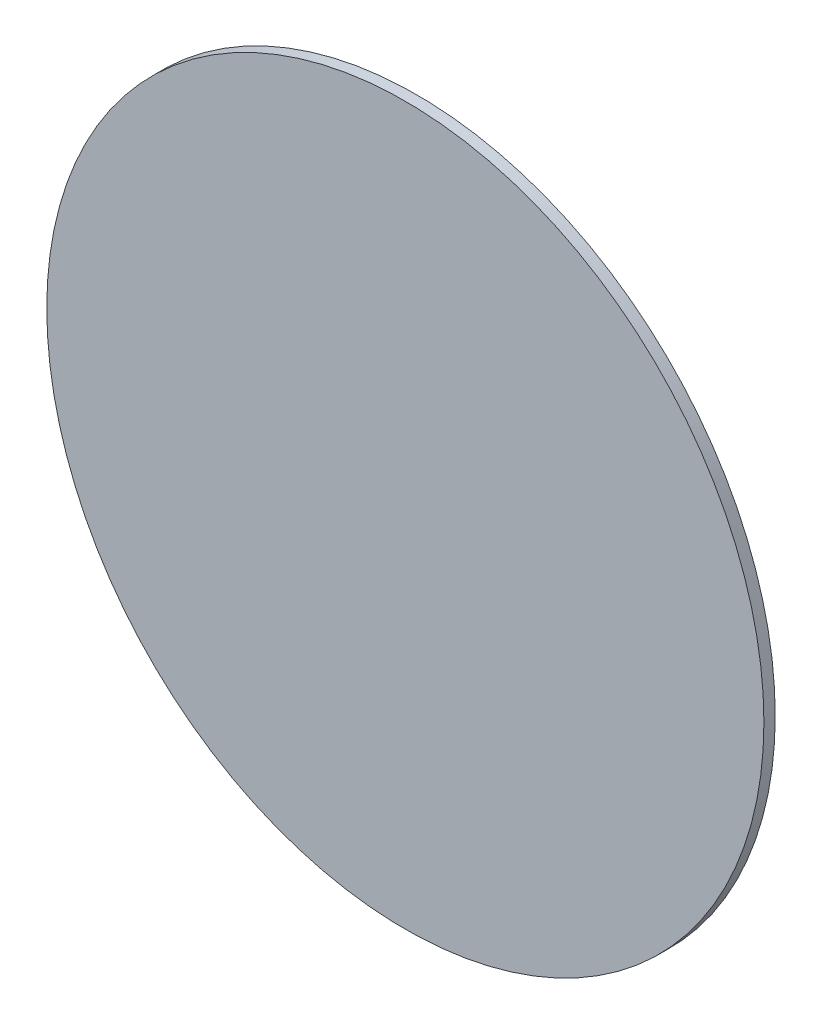
ISO-10303-21;
HEADER;
FILE_DESCRIPTION(('STEP AP214'),'2;1');
FILE_NAME('part.step','',(''),(''),'','','');
FILE_SCHEMA(('AUTOMOTIVE_DESIGN { 1 0 10303 214 1 1 1 1 }'));
ENDSEC;
DATA;
#1=APPLICATION_CONTEXT('core data for automotive mechanical design processes');
#2=APPLICATION_PROTOCOL_DEFINITION('international standard','automotive_design',2000,#1);
#3=PRODUCT_CONTEXT('',#1,'mechanical');
#4=PRODUCT('Part','Part','',(#3));
#5=PRODUCT_RELATED_PRODUCT_CATEGORY('part','',(#4));
#6=PRODUCT_DEFINITION_FORMATION('','',#4);
#7=PRODUCT_DEFINITION_CONTEXT('part definition',#1,'design');
#8=PRODUCT_DEFINITION('design','',#6,#7);
#9=PRODUCT_DEFINITION_SHAPE('','',#8);
#10=(LENGTH_UNIT() NAMED_UNIT(*) SI_UNIT(.MILLI.,.METRE.));
#11=(NAMED_UNIT(*) PLANE_ANGLE_UNIT() SI_UNIT($,.RADIAN.));
#12=(NAMED_UNIT(*) SI_UNIT($,.STERADIAN.) SOLID_ANGLE_UNIT());
#13=UNCERTAINTY_MEASURE_WITH_UNIT(LENGTH_MEASURE(1.E-05),#10,'distance_accuracy_value','');
#14=(GEOMETRIC_REPRESENTATION_CONTEXT(3) GLOBAL_UNCERTAINTY_ASSIGNED_CONTEXT((#13)) GLOBAL_UNIT_ASSIGNED_CONTEXT((#10,
#11,#12)) REPRESENTATION_CONTEXT('',''));
#15=CARTESIAN_POINT('',(0.,0.,0.));
#16=DIRECTION('',(0.,0.,1.));
#17=DIRECTION('',(1.,0.,0.));
#18=AXIS2_PLACEMENT_3D('',#15,#16,#17);
#19=CARTESIAN_POINT('',(0.,0.,3.));
#20=DIRECTION('',(0.,0.,-1.));
#21=DIRECTION('',(-1.,0.,0.));
#22=AXIS2_PLACEMENT_3D('',#19,#20,#21);
#23=CYLINDRICAL_SURFACE('',#22,95.);
#24=CARTESIAN_POINT('',(0.,0.,3.));
#25=DIRECTION('',(0.,0.,1.));
#26=DIRECTION('',(1.,0.,0.));
#27=AXIS2_PLACEMENT_3D('',#24,#25,#26);
#28=CIRCLE('',#27,95.);
#29=CARTESIAN_POINT('',(95.,0.,3.));
#30=VERTEX_POINT('',#29);
#31=EDGE_CURVE('E10',#30,#30,#28,.T.);
#32=ORIENTED_EDGE('',*,*,#31,.F.);
#33=EDGE_LOOP('',(#32));
#34=FACE_BOUND('',#33,.T.);
#35=CARTESIAN_POINT('',(0.,0.,0.));
#36=DIRECTION('',(0.,0.,1.));
#37=DIRECTION('',(1.,0.,0.));
#38=AXIS2_PLACEMENT_3D('',#35,#36,#37);
#39=CIRCLE('',#38,95.);
#40=CARTESIAN_POINT('',(95.,0.,0.));
#41=VERTEX_POINT('',#40);
#42=EDGE_CURVE('E37',#41,#41,#39,.T.);
#43=ORIENTED_EDGE('',*,*,#42,.T.);
#44=EDGE_LOOP('',(#43));
#45=FACE_BOUND('',#44,.T.);
#46=ADVANCED_FACE('F34',(#34,#45),#23,.T.);
#47=CARTESIAN_POINT('',(0.,0.,3.));
#48=DIRECTION('',(0.,0.,1.));
#49=DIRECTION('',(1.,0.,0.));
#50=AXIS2_PLACEMENT_3D('',#47,#48,#49);
#51=PLANE('',#50);
#52=ORIENTED_EDGE('',*,*,#31,.T.);
#53=EDGE_LOOP('',(#52));
#54=FACE_BOUND('',#53,.T.);
#55=ADVANCED_FACE('F49',(#54),#51,.T.);
#56=CARTESIAN_POINT('',(0.,0.,0.));
#57=DIRECTION('',(0.,0.,1.));
#58=DIRECTION('',(1.,0.,0.));
#59=AXIS2_PLACEMENT_3D('',#56,#57,#58);
#60=PLANE('',#59);
#61=ORIENTED_EDGE('',*,*,#42,.F.);
#62=EDGE_LOOP('',(#61));
#63=FACE_BOUND('',#62,.T.);
#64=ADVANCED_FACE('F47',(#63),#60,.F.);
#65=CLOSED_SHELL('',(#46,#55,#64));
#66=MANIFOLD_SOLID_BREP('B2',#65);
#67=ADVANCED_BREP_SHAPE_REPRESENTATION('',(#18,#66),#14);
#68=SHAPE_DEFINITION_REPRESENTATION(#9,#67);
ENDSEC;
END-ISO-10303-21;
